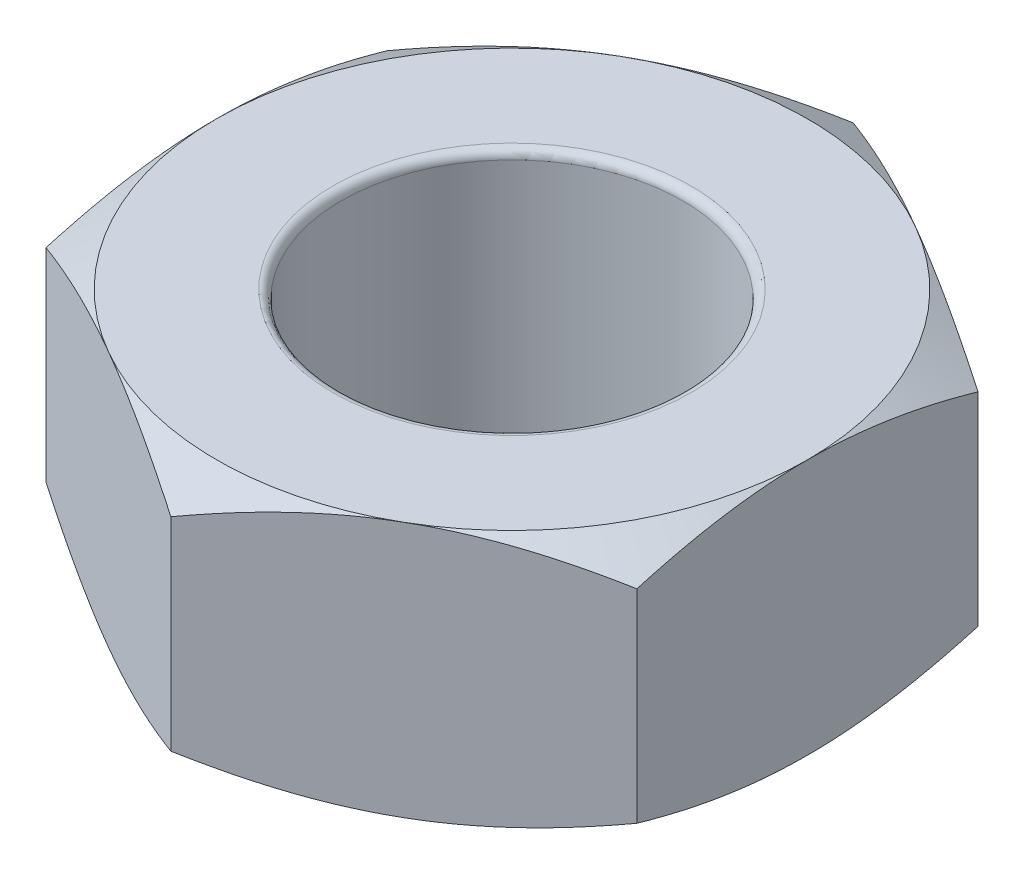
ISO-10303-21;
HEADER;
FILE_DESCRIPTION(('STEP AP214'),'2;1');
FILE_NAME('part.step','',(''),(''),'','','');
FILE_SCHEMA(('AUTOMOTIVE_DESIGN { 1 0 10303 214 1 1 1 1 }'));
ENDSEC;
DATA;
#1=APPLICATION_CONTEXT('core data for automotive mechanical design processes');
#2=APPLICATION_PROTOCOL_DEFINITION('international standard','automotive_design',2000,#1);
#3=PRODUCT_CONTEXT('',#1,'mechanical');
#4=PRODUCT('Part','Part','',(#3));
#5=PRODUCT_RELATED_PRODUCT_CATEGORY('part','',(#4));
#6=PRODUCT_DEFINITION_FORMATION('','',#4);
#7=PRODUCT_DEFINITION_CONTEXT('part definition',#1,'design');
#8=PRODUCT_DEFINITION('design','',#6,#7);
#9=PRODUCT_DEFINITION_SHAPE('','',#8);
#10=(LENGTH_UNIT() NAMED_UNIT(*) SI_UNIT(.MILLI.,.METRE.));
#11=(NAMED_UNIT(*) PLANE_ANGLE_UNIT() SI_UNIT($,.RADIAN.));
#12=(NAMED_UNIT(*) SI_UNIT($,.STERADIAN.) SOLID_ANGLE_UNIT());
#13=UNCERTAINTY_MEASURE_WITH_UNIT(LENGTH_MEASURE(1.E-05),#10,'distance_accuracy_value','');
#14=(GEOMETRIC_REPRESENTATION_CONTEXT(3) GLOBAL_UNCERTAINTY_ASSIGNED_CONTEXT((#13)) GLOBAL_UNIT_ASSIGNED_CONTEXT((#10,
#11,#12)) REPRESENTATION_CONTEXT('',''));
#15=CARTESIAN_POINT('',(0.,0.,0.));
#16=DIRECTION('',(0.,0.,1.));
#17=DIRECTION('',(1.,0.,0.));
#18=AXIS2_PLACEMENT_3D('',#15,#16,#17);
#19=CARTESIAN_POINT('',(1.73205080756888,1.5,-1.));
#20=DIRECTION('',(-0.5,0.,0.866025403784439));
#21=DIRECTION('',(0.866025403784439,0.,0.5));
#22=AXIS2_PLACEMENT_3D('',#19,#20,#21);
#23=PLANE('',#22);
#24=CARTESIAN_POINT('',(-0.000200000000000193,0.154767210819087,-2.00011547005384));
#25=CARTESIAN_POINT('',(0.0759165186948394,0.129383332818549,-1.9561695774956));
#26=CARTESIAN_POINT('',(0.152690066634804,0.106297187993155,-1.91184434892581));
#27=CARTESIAN_POINT('',(0.307566720247552,0.0659990961299756,-1.82242627127131));
#28=CARTESIAN_POINT('',(0.385672578921111,0.048801406793809,-1.77733183274084));
#29=CARTESIAN_POINT('',(0.540916268137864,0.0220293372969049,-1.68770184698156));
#30=CARTESIAN_POINT('',(0.618030205396501,0.0122767979293241,-1.64318009454701));
#31=CARTESIAN_POINT('',(0.772621133871574,0.000631938665477011,-1.55392698037765));
#32=CARTESIAN_POINT('',(0.850097562772869,-0.00127002168629369,-1.50919594329564));
#33=CARTESIAN_POINT('',(0.994880319540313,0.00267579111850239,-1.42560557970194));
#34=CARTESIAN_POINT('',(1.06220826399937,0.00755473009185104,-1.38673377284452));
#35=CARTESIAN_POINT('',(1.19642548850006,0.0230214979715317,-1.30924342214916));
#36=CARTESIAN_POINT('',(1.26331430392338,0.0336146160353385,-1.27062514655873));
#37=CARTESIAN_POINT('',(1.39780850908246,0.0600979273322419,-1.19297488100569));
#38=CARTESIAN_POINT('',(1.46539686672829,0.0761004403986394,-1.15395272452479));
#39=CARTESIAN_POINT('',(1.59956521690773,0.11242036469852,-1.07649059143196));
#40=CARTESIAN_POINT('',(1.66614692982892,0.132729235815867,-1.0380496215538));
#41=CARTESIAN_POINT('',(1.73225080756888,0.154767210819086,-0.999884529946163));
#42=B_SPLINE_CURVE_WITH_KNOTS('',3,(#24,#25,#26,#27,#28,#29,#30,#31,#32,#33,#34,#35,#36,#37,#38,
#39,#40,#41),.UNSPECIFIED.,.F.,.F.,(4,2,2,2,2,2,2,2,4),(0.,0.27455973272559,0.54977963137929,
0.818187148094556,1.08626496403989,1.31973233850631,1.55341618675482,1.79228517679321,
2.03068481371441),.UNSPECIFIED.);
#43=CARTESIAN_POINT('',(0.,0.154700538379251,-2.));
#44=VERTEX_POINT('',#43);
#45=CARTESIAN_POINT('',(0.866025403784439,0.,-1.5));
#46=VERTEX_POINT('',#45);
#47=EDGE_CURVE('E69',#44,#46,#42,.T.);
#48=ORIENTED_EDGE('',*,*,#47,.F.);
#49=DIRECTION('',(0.,-1.,0.));
#50=VECTOR('',#49,1.);
#51=CARTESIAN_POINT('',(0.,1.5,-2.));
#52=LINE('',#51,#50);
#53=CARTESIAN_POINT('',(0.,1.34529946162075,-2.));
#54=VERTEX_POINT('',#53);
#55=EDGE_CURVE('E353',#54,#44,#52,.T.);
#56=ORIENTED_EDGE('',*,*,#55,.F.);
#57=CARTESIAN_POINT('',(1.73225080756888,1.34523278918091,-0.999884529946163));
#58=CARTESIAN_POINT('',(1.65613428887404,1.37061666718145,-1.04383042250441));
#59=CARTESIAN_POINT('',(1.57936074093407,1.39370281200685,-1.08815565107419));
#60=CARTESIAN_POINT('',(1.42448408732132,1.43400090387002,-1.1775737287287));
#61=CARTESIAN_POINT('',(1.34637822864777,1.45119859320619,-1.22266816725916));
#62=CARTESIAN_POINT('',(1.19113453943101,1.4779706627031,-1.31229815301844));
#63=CARTESIAN_POINT('',(1.11402060217238,1.48772320207068,-1.35681990545299));
#64=CARTESIAN_POINT('',(0.959429673697302,1.49936806133452,-1.44607301962235));
#65=CARTESIAN_POINT('',(0.881953244796007,1.50127002168629,-1.49080405670436));
#66=CARTESIAN_POINT('',(0.737170488028564,1.4973242088815,-1.57439442029806));
#67=CARTESIAN_POINT('',(0.669842543569503,1.49244526990815,-1.61326622715548));
#68=CARTESIAN_POINT('',(0.535625319068816,1.47697850202847,-1.69075657785084));
#69=CARTESIAN_POINT('',(0.468736503645497,1.46638538396466,-1.72937485344127));
#70=CARTESIAN_POINT('',(0.334242298486415,1.43990207266776,-1.80702511899431));
#71=CARTESIAN_POINT('',(0.266653940840587,1.42389955960136,-1.84604727547521));
#72=CARTESIAN_POINT('',(0.132485590661142,1.38757963530148,-1.92350940856804));
#73=CARTESIAN_POINT('',(0.0659038777399554,1.36727076418413,-1.9619503784462));
#74=CARTESIAN_POINT('',(-0.000200000000000049,1.34523278918091,-2.00011547005384));
#75=B_SPLINE_CURVE_WITH_KNOTS('',3,(#57,#58,#59,#60,#61,#62,#63,#64,#65,#66,#67,#68,#69,#70,#71,
#72,#73,#74),.UNSPECIFIED.,.F.,.F.,(4,2,2,2,2,2,2,2,4),(0.,0.274559732725589,0.54977963137929,
0.818187148094555,1.08626496403989,1.31973233850631,1.55341618675482,1.79228517679321,
2.03068481371441),.UNSPECIFIED.);
#76=CARTESIAN_POINT('',(0.866025403784439,1.5,-1.5));
#77=VERTEX_POINT('',#76);
#78=EDGE_CURVE('E284',#77,#54,#75,.T.);
#79=ORIENTED_EDGE('',*,*,#78,.F.);
#80=CARTESIAN_POINT('',(1.73205080756888,1.34529946162075,-1.));
#81=VERTEX_POINT('',#80);
#82=EDGE_CURVE('E372',#81,#77,#75,.T.);
#83=ORIENTED_EDGE('',*,*,#82,.F.);
#84=DIRECTION('',(0.,-1.,0.));
#85=VECTOR('',#84,1.);
#86=CARTESIAN_POINT('',(1.73205080756888,1.5,-1.));
#87=LINE('',#86,#85);
#88=CARTESIAN_POINT('',(1.73205080756888,0.15470053837925,-1.));
#89=VERTEX_POINT('',#88);
#90=EDGE_CURVE('E369',#81,#89,#87,.T.);
#91=ORIENTED_EDGE('',*,*,#90,.T.);
#92=EDGE_CURVE('E157',#46,#89,#42,.T.);
#93=ORIENTED_EDGE('',*,*,#92,.F.);
#94=EDGE_LOOP('',(#48,#56,#79,#83,#91,#93));
#95=FACE_BOUND('',#94,.T.);
#96=ADVANCED_FACE('F53',(#95),#23,.F.);
#97=CARTESIAN_POINT('',(0.,1.5,-2.));
#98=DIRECTION('',(0.5,0.,0.866025403784439));
#99=DIRECTION('',(0.866025403784439,0.,-0.5));
#100=AXIS2_PLACEMENT_3D('',#97,#98,#99);
#101=PLANE('',#100);
#102=CARTESIAN_POINT('',(-1.73225080756888,0.154767210819087,-0.999884529946163));
#103=CARTESIAN_POINT('',(-1.65613428887404,0.129383332818549,-1.04383042250441));
#104=CARTESIAN_POINT('',(-1.57936074093407,0.106297187993155,-1.08815565107419));
#105=CARTESIAN_POINT('',(-1.42448408732133,0.0659990961299757,-1.1775737287287));
#106=CARTESIAN_POINT('',(-1.34637822864777,0.048801406793809,-1.22266816725916));
#107=CARTESIAN_POINT('',(-1.19113453943101,0.022029337296905,-1.31229815301844));
#108=CARTESIAN_POINT('',(-1.11402060217238,0.0122767979293242,-1.35681990545299));
#109=CARTESIAN_POINT('',(-0.959429673697303,0.000631938665477067,-1.44607301962235));
#110=CARTESIAN_POINT('',(-0.881953244796008,-0.00127002168629364,-1.49080405670436));
#111=CARTESIAN_POINT('',(-0.737170488028564,0.00267579111850253,-1.57439442029806));
#112=CARTESIAN_POINT('',(-0.669842543569503,0.00755473009185129,-1.61326622715548));
#113=CARTESIAN_POINT('',(-0.535625319068816,0.0230214979715321,-1.69075657785084));
#114=CARTESIAN_POINT('',(-0.468736503645497,0.0336146160353389,-1.72937485344127));
#115=CARTESIAN_POINT('',(-0.334242298486415,0.0600979273322423,-1.80702511899431));
#116=CARTESIAN_POINT('',(-0.266653940840587,0.0761004403986399,-1.84604727547521));
#117=CARTESIAN_POINT('',(-0.132485590661142,0.112420364698521,-1.92350940856804));
#118=CARTESIAN_POINT('',(-0.0659038777399555,0.132729235815868,-1.9619503784462));
#119=CARTESIAN_POINT('',(0.000200000000000089,0.154767210819087,-2.00011547005384));
#120=B_SPLINE_CURVE_WITH_KNOTS('',3,(#102,#103,#104,#105,#106,#107,#108,#109,#110,#111,#112,
#113,#114,#115,#116,#117,#118,#119),.UNSPECIFIED.,.F.,.F.,(4,2,2,2,2,2,2,2,4),(0.,
0.274559732725589,0.54977963137929,0.818187148094556,1.08626496403989,1.31973233850631,
1.55341618675482,1.79228517679322,2.03068481371441),.UNSPECIFIED.);
#121=CARTESIAN_POINT('',(-1.73205080756888,0.154700538379251,-1.));
#122=VERTEX_POINT('',#121);
#123=CARTESIAN_POINT('',(-0.866025403784439,0.,-1.5));
#124=VERTEX_POINT('',#123);
#125=EDGE_CURVE('E77',#122,#124,#120,.T.);
#126=ORIENTED_EDGE('',*,*,#125,.F.);
#127=DIRECTION('',(0.,-1.,0.));
#128=VECTOR('',#127,1.);
#129=CARTESIAN_POINT('',(-1.73205080756888,1.5,-1.));
#130=LINE('',#129,#128);
#131=CARTESIAN_POINT('',(-1.73205080756888,1.34529946162075,-1.));
#132=VERTEX_POINT('',#131);
#133=EDGE_CURVE('E357',#132,#122,#130,.T.);
#134=ORIENTED_EDGE('',*,*,#133,.F.);
#135=CARTESIAN_POINT('',(0.000199999999999846,1.34523278918091,-2.00011547005384));
#136=CARTESIAN_POINT('',(-0.0759165186948396,1.37061666718145,-1.9561695774956));
#137=CARTESIAN_POINT('',(-0.152690066634804,1.39370281200684,-1.91184434892581));
#138=CARTESIAN_POINT('',(-0.307566720247552,1.43400090387002,-1.82242627127131));
#139=CARTESIAN_POINT('',(-0.385672578921111,1.45119859320619,-1.77733183274084));
#140=CARTESIAN_POINT('',(-0.540916268137865,1.4779706627031,-1.68770184698156));
#141=CARTESIAN_POINT('',(-0.618030205396501,1.48772320207068,-1.64318009454701));
#142=CARTESIAN_POINT('',(-0.772621133871575,1.49936806133452,-1.55392698037765));
#143=CARTESIAN_POINT('',(-0.85009756277287,1.50127002168629,-1.50919594329564));
#144=CARTESIAN_POINT('',(-0.994880319540313,1.4973242088815,-1.42560557970194));
#145=CARTESIAN_POINT('',(-1.06220826399937,1.49244526990815,-1.38673377284452));
#146=CARTESIAN_POINT('',(-1.19642548850006,1.47697850202847,-1.30924342214916));
#147=CARTESIAN_POINT('',(-1.26331430392338,1.46638538396466,-1.27062514655873));
#148=CARTESIAN_POINT('',(-1.39780850908246,1.43990207266776,-1.19297488100569));
#149=CARTESIAN_POINT('',(-1.46539686672829,1.42389955960136,-1.15395272452479));
#150=CARTESIAN_POINT('',(-1.59956521690774,1.38757963530148,-1.07649059143196));
#151=CARTESIAN_POINT('',(-1.66614692982892,1.36727076418413,-1.0380496215538));
#152=CARTESIAN_POINT('',(-1.73225080756888,1.34523278918091,-0.999884529946163));
#153=B_SPLINE_CURVE_WITH_KNOTS('',3,(#135,#136,#137,#138,#139,#140,#141,#142,#143,#144,#145,
#146,#147,#148,#149,#150,#151,#152),.UNSPECIFIED.,.F.,.F.,(4,2,2,2,2,2,2,2,4),(0.,
0.274559732725589,0.54977963137929,0.818187148094556,1.08626496403989,1.31973233850631,
1.55341618675482,1.79228517679322,2.03068481371441),.UNSPECIFIED.);
#154=CARTESIAN_POINT('',(-0.866025403784439,1.5,-1.5));
#155=VERTEX_POINT('',#154);
#156=EDGE_CURVE('E276',#155,#132,#153,.T.);
#157=ORIENTED_EDGE('',*,*,#156,.F.);
#158=EDGE_CURVE('E283',#54,#155,#153,.T.);
#159=ORIENTED_EDGE('',*,*,#158,.F.);
#160=ORIENTED_EDGE('',*,*,#55,.T.);
#161=EDGE_CURVE('E189',#124,#44,#120,.T.);
#162=ORIENTED_EDGE('',*,*,#161,.F.);
#163=EDGE_LOOP('',(#126,#134,#157,#159,#160,#162));
#164=FACE_BOUND('',#163,.T.);
#165=ADVANCED_FACE('F290',(#164),#101,.F.);
#166=CARTESIAN_POINT('',(-1.73205080756888,1.5,-1.));
#167=DIRECTION('',(1.,0.,0.));
#168=DIRECTION('',(0.,0.,-1.));
#169=AXIS2_PLACEMENT_3D('',#166,#167,#168);
#170=PLANE('',#169);
#171=CARTESIAN_POINT('',(-1.73205080756888,1.25472836797103,3.5002));
#172=CARTESIAN_POINT('',(-1.73205080756888,1.21270316876776,3.41898141413741));
#173=CARTESIAN_POINT('',(-1.73205080756888,1.17090076865851,3.33764821075224));
#174=CARTESIAN_POINT('',(-1.73205080756888,1.08784306120711,3.17470136721006));
#175=CARTESIAN_POINT('',(-1.73205080756888,1.04658776301326,3.09308772239235));
#176=CARTESIAN_POINT('',(-1.73205080756888,0.923669288820031,2.8474984986909));
#177=CARTESIAN_POINT('',(-1.73205080756888,0.84298516472278,2.68302747411278));
#178=CARTESIAN_POINT('',(-1.73205080756888,0.722843384153396,2.43042768656936));
#179=CARTESIAN_POINT('',(-1.73205080756888,0.681937922239003,2.34298808344512));
#180=CARTESIAN_POINT('',(-1.73205080756888,0.601560507874701,2.16745378194778));
#181=CARTESIAN_POINT('',(-1.73205080756888,0.562088504642535,2.07935910691499));
#182=CARTESIAN_POINT('',(-1.73205080756888,0.48501098088733,1.90240505280635));
#183=CARTESIAN_POINT('',(-1.73205080756888,0.447404540220218,1.81354607659919));
#184=CARTESIAN_POINT('',(-1.73205080756888,0.374616129551163,1.63484513992671));
#185=CARTESIAN_POINT('',(-1.73205080756888,0.339433928504776,1.54500327408496));
#186=CARTESIAN_POINT('',(-1.73205080756888,0.267342314487574,1.35084784362632));
#187=CARTESIAN_POINT('',(-1.73205080756888,0.230936594204428,1.24634465038537));
#188=CARTESIAN_POINT('',(-1.73205080756888,0.163975832260871,1.03550034878867));
#189=CARTESIAN_POINT('',(-1.73205080756888,0.133417935655831,0.929160165052525));
#190=CARTESIAN_POINT('',(-1.73205080756888,0.0808059211059744,0.71655133275406));
#191=CARTESIAN_POINT('',(-1.73205080756888,0.0585969520152135,0.610322086773511));
#192=CARTESIAN_POINT('',(-1.73205080756888,0.0241269035945811,0.396264237475995));
#193=CARTESIAN_POINT('',(-1.73205080756888,0.0118598825395636,0.288436628706989));
#194=CARTESIAN_POINT('',(-1.73205080756888,-0.00115685488455073,0.0704248932692721));
#195=CARTESIAN_POINT('',(-1.73205080756888,-0.0017306186725579,-0.0397702878210252));
#196=CARTESIAN_POINT('',(-1.73205080756888,0.00918341161357058,-0.259562580407462));
#197=CARTESIAN_POINT('',(-1.73205080756888,0.0206746669828802,-0.369159511203943));
#198=CARTESIAN_POINT('',(-1.73205080756888,0.0544132919530276,-0.588951518486415));
#199=CARTESIAN_POINT('',(-1.73205080756888,0.0768793317815982,-0.699111653280236));
#200=CARTESIAN_POINT('',(-1.73205080756888,0.130156974687668,-0.917374597457742));
#201=CARTESIAN_POINT('',(-1.73205080756888,0.160971774943208,-1.02547660166626));
#202=CARTESIAN_POINT('',(-1.73205080756888,0.228415317711028,-1.23892452125311));
#203=CARTESIAN_POINT('',(-1.73205080756888,0.264998923406584,-1.34428499009296));
#204=CARTESIAN_POINT('',(-1.73205080756888,0.342472165522482,-1.55342383574145));
#205=CARTESIAN_POINT('',(-1.73205080756888,0.383363024008193,-1.65720175393206));
#206=CARTESIAN_POINT('',(-1.73205080756888,0.468300391429515,-1.86358689323178));
#207=CARTESIAN_POINT('',(-1.73205080756888,0.512350486049606,-1.966192625836));
#208=CARTESIAN_POINT('',(-1.73205080756888,0.602738559610233,-2.17039283651753));
#209=CARTESIAN_POINT('',(-1.73205080756888,0.649076675082705,-2.27198725381139));
#210=CARTESIAN_POINT('',(-1.73205080756888,0.740654325439852,-2.46835472186679));
#211=CARTESIAN_POINT('',(-1.73205080756888,0.785795185673095,-2.563173984224));
#212=CARTESIAN_POINT('',(-1.73205080756888,0.877250450892286,-2.7522479187581));
#213=CARTESIAN_POINT('',(-1.73205080756888,0.923564899248911,-2.84650256990983));
#214=CARTESIAN_POINT('',(-1.73205080756888,1.01694315968054,-3.03421263080168));
#215=CARTESIAN_POINT('',(-1.73205080756888,1.06400364491327,-3.12766969941864));
#216=CARTESIAN_POINT('',(-1.73205080756888,1.15885831902139,-3.3142003324061));
#217=CARTESIAN_POINT('',(-1.73205080756888,1.20665244072873,-3.40727393090713));
#218=CARTESIAN_POINT('',(-1.73205080756888,1.25472836797103,-3.5002));
#219=B_SPLINE_CURVE_WITH_KNOTS('',3,(#171,#172,#173,#174,#175,#176,#177,#178,#179,#180,#181,
#182,#183,#184,#185,#186,#187,#188,#189,#190,#191,#192,#193,#194,#195,#196,#197,#198,#199,#200,
#201,#202,#203,#204,#205,#206,#207,#208,#209,#210,#211,#212,#213,#214,#215,#216,#217,#218),
.UNSPECIFIED.,.F.,.F.,(4,2,2,2,2,2,2,2,2,2,2,2,2,2,2,2,2,2,2,2,2,2,2,4),(0.,0.274339433850929,
0.548683449265063,1.09822658782748,1.38782117882733,1.67740550051019,1.96684554185917,
2.25625795958764,2.58812456595652,2.91982873728265,3.24503531110895,3.57004738422789,
3.89994647679448,4.2299402389355,4.56679513036709,4.90377920397771,5.23824669540495,
5.57280933976728,5.90775790755156,6.24272648676792,6.55776506644743,6.87281530560184,
7.186722965665,7.50060205535077),.UNSPECIFIED.);
#220=CARTESIAN_POINT('',(-1.73205080756888,0.15470053837925,1.));
#221=VERTEX_POINT('',#220);
#222=CARTESIAN_POINT('',(-1.73205080756888,0.,0.));
#223=VERTEX_POINT('',#222);
#224=EDGE_CURVE('E411',#221,#223,#219,.T.);
#225=ORIENTED_EDGE('',*,*,#224,.F.);
#226=DIRECTION('',(0.,-1.,0.));
#227=VECTOR('',#226,1.);
#228=CARTESIAN_POINT('',(-1.73205080756888,1.5,1.));
#229=LINE('',#228,#227);
#230=CARTESIAN_POINT('',(-1.73205080756888,1.34529946162075,1.));
#231=VERTEX_POINT('',#230);
#232=EDGE_CURVE('E361',#231,#221,#229,.T.);
#233=ORIENTED_EDGE('',*,*,#232,.F.);
#234=CARTESIAN_POINT('',(-1.73205080756888,0.24527163202897,-3.5002));
#235=CARTESIAN_POINT('',(-1.73205080756888,0.287296831232237,-3.41898141413741));
#236=CARTESIAN_POINT('',(-1.73205080756888,0.329099231341488,-3.33764821075224));
#237=CARTESIAN_POINT('',(-1.73205080756888,0.412156938792886,-3.17470136721006));
#238=CARTESIAN_POINT('',(-1.73205080756888,0.453412236986736,-3.09308772239235));
#239=CARTESIAN_POINT('',(-1.73205080756888,0.576330711179969,-2.8474984986909));
#240=CARTESIAN_POINT('',(-1.73205080756888,0.65701483527722,-2.68302747411278));
#241=CARTESIAN_POINT('',(-1.73205080756888,0.777156615846604,-2.43042768656936));
#242=CARTESIAN_POINT('',(-1.73205080756888,0.818062077760997,-2.34298808344511));
#243=CARTESIAN_POINT('',(-1.73205080756888,0.898439492125299,-2.16745378194778));
#244=CARTESIAN_POINT('',(-1.73205080756888,0.937911495357465,-2.07935910691499));
#245=CARTESIAN_POINT('',(-1.73205080756888,1.01498901911267,-1.90240505280635));
#246=CARTESIAN_POINT('',(-1.73205080756888,1.05259545977978,-1.81354607659919));
#247=CARTESIAN_POINT('',(-1.73205080756888,1.12538387044884,-1.63484513992671));
#248=CARTESIAN_POINT('',(-1.73205080756888,1.16056607149522,-1.54500327408496));
#249=CARTESIAN_POINT('',(-1.73205080756888,1.23265768551243,-1.35084784362632));
#250=CARTESIAN_POINT('',(-1.73205080756888,1.26906340579557,-1.24634465038537));
#251=CARTESIAN_POINT('',(-1.73205080756888,1.33602416773913,-1.03550034878867));
#252=CARTESIAN_POINT('',(-1.73205080756888,1.36658206434417,-0.929160165052525));
#253=CARTESIAN_POINT('',(-1.73205080756888,1.41919407889403,-0.716551332754059));
#254=CARTESIAN_POINT('',(-1.73205080756888,1.44140304798479,-0.61032208677351));
#255=CARTESIAN_POINT('',(-1.73205080756888,1.47587309640542,-0.396264237475994));
#256=CARTESIAN_POINT('',(-1.73205080756888,1.48814011746044,-0.288436628706988));
#257=CARTESIAN_POINT('',(-1.73205080756888,1.50115685488455,-0.0704248932692712));
#258=CARTESIAN_POINT('',(-1.73205080756888,1.50173061867256,0.0397702878210261));
#259=CARTESIAN_POINT('',(-1.73205080756888,1.49081658838643,0.259562580407462));
#260=CARTESIAN_POINT('',(-1.73205080756888,1.47932533301712,0.369159511203944));
#261=CARTESIAN_POINT('',(-1.73205080756888,1.44558670804697,0.588951518486416));
#262=CARTESIAN_POINT('',(-1.73205080756888,1.4231206682184,0.699111653280237));
#263=CARTESIAN_POINT('',(-1.73205080756888,1.36984302531233,0.917374597457744));
#264=CARTESIAN_POINT('',(-1.73205080756888,1.33902822505679,1.02547660166627));
#265=CARTESIAN_POINT('',(-1.73205080756888,1.27158468228897,1.23892452125312));
#266=CARTESIAN_POINT('',(-1.73205080756888,1.23500107659342,1.34428499009296));
#267=CARTESIAN_POINT('',(-1.73205080756888,1.15752783447752,1.55342383574145));
#268=CARTESIAN_POINT('',(-1.73205080756888,1.11663697599181,1.65720175393206));
#269=CARTESIAN_POINT('',(-1.73205080756888,1.03169960857048,1.86358689323178));
#270=CARTESIAN_POINT('',(-1.73205080756888,0.987649513950394,1.966192625836));
#271=CARTESIAN_POINT('',(-1.73205080756888,0.897261440389768,2.17039283651753));
#272=CARTESIAN_POINT('',(-1.73205080756888,0.850923324917295,2.27198725381139));
#273=CARTESIAN_POINT('',(-1.73205080756888,0.759345674560149,2.46835472186679));
#274=CARTESIAN_POINT('',(-1.73205080756888,0.714204814326906,2.563173984224));
#275=CARTESIAN_POINT('',(-1.73205080756888,0.622749549107715,2.7522479187581));
#276=CARTESIAN_POINT('',(-1.73205080756888,0.576435100751089,2.84650256990983));
#277=CARTESIAN_POINT('',(-1.73205080756888,0.483056840319463,3.03421263080167));
#278=CARTESIAN_POINT('',(-1.73205080756888,0.435996355086728,3.12766969941864));
#279=CARTESIAN_POINT('',(-1.73205080756888,0.341141680978613,3.3142003324061));
#280=CARTESIAN_POINT('',(-1.73205080756888,0.293347559271275,3.40727393090713));
#281=CARTESIAN_POINT('',(-1.73205080756888,0.245271632028971,3.5002));
#282=B_SPLINE_CURVE_WITH_KNOTS('',3,(#234,#235,#236,#237,#238,#239,#240,#241,#242,#243,#244,
#245,#246,#247,#248,#249,#250,#251,#252,#253,#254,#255,#256,#257,#258,#259,#260,#261,#262,#263,
#264,#265,#266,#267,#268,#269,#270,#271,#272,#273,#274,#275,#276,#277,#278,#279,#280,#281),
.UNSPECIFIED.,.F.,.F.,(4,2,2,2,2,2,2,2,2,2,2,2,2,2,2,2,2,2,2,2,2,2,2,4),(0.,0.274339433850929,
0.548683449265063,1.09822658782749,1.38782117882733,1.67740550051019,1.96684554185917,
2.25625795958764,2.58812456595652,2.91982873728265,3.24503531110895,3.57004738422789,
3.89994647679449,4.2299402389355,4.5667951303671,4.90377920397771,5.23824669540495,
5.57280933976728,5.90775790755156,6.24272648676792,6.55776506644743,6.87281530560184,
7.18672296566501,7.50060205535077),.UNSPECIFIED.);
#283=CARTESIAN_POINT('',(-1.73205080756888,1.5,0.));
#284=VERTEX_POINT('',#283);
#285=EDGE_CURVE('E268',#284,#231,#282,.T.);
#286=ORIENTED_EDGE('',*,*,#285,.F.);
#287=EDGE_CURVE('E275',#132,#284,#282,.T.);
#288=ORIENTED_EDGE('',*,*,#287,.F.);
#289=ORIENTED_EDGE('',*,*,#133,.T.);
#290=EDGE_CURVE('E225',#223,#122,#219,.T.);
#291=ORIENTED_EDGE('',*,*,#290,.F.);
#292=EDGE_LOOP('',(#225,#233,#286,#288,#289,#291));
#293=FACE_BOUND('',#292,.T.);
#294=ADVANCED_FACE('F248',(#293),#170,.F.);
#295=CARTESIAN_POINT('',(-1.73205080756888,1.5,1.));
#296=DIRECTION('',(0.5,0.,-0.866025403784439));
#297=DIRECTION('',(-0.866025403784439,0.,-0.5));
#298=AXIS2_PLACEMENT_3D('',#295,#296,#297);
#299=PLANE('',#298);
#300=CARTESIAN_POINT('',(0.000199999999999623,0.154767210819086,2.00011547005384));
#301=CARTESIAN_POINT('',(-0.0759165186948399,0.129383332818549,1.95616957749559));
#302=CARTESIAN_POINT('',(-0.152690066634804,0.106297187993155,1.91184434892581));
#303=CARTESIAN_POINT('',(-0.307566720247553,0.0659990961299753,1.8224262712713));
#304=CARTESIAN_POINT('',(-0.385672578921111,0.0488014067938086,1.77733183274084));
#305=CARTESIAN_POINT('',(-0.540916268137865,0.0220293372969047,1.68770184698156));
#306=CARTESIAN_POINT('',(-0.618030205396501,0.0122767979293239,1.64318009454701));
#307=CARTESIAN_POINT('',(-0.772621133871575,0.000631938665476742,1.55392698037765));
#308=CARTESIAN_POINT('',(-0.850097562772869,-0.00127002168629401,1.50919594329564));
#309=CARTESIAN_POINT('',(-0.994880319540313,0.00267579111850214,1.42560557970194));
#310=CARTESIAN_POINT('',(-1.06220826399937,0.00755473009185091,1.38673377284452));
#311=CARTESIAN_POINT('',(-1.19642548850006,0.0230214979715317,1.30924342214916));
#312=CARTESIAN_POINT('',(-1.26331430392338,0.0336146160353384,1.27062514655873));
#313=CARTESIAN_POINT('',(-1.39780850908246,0.0600979273322418,1.19297488100569));
#314=CARTESIAN_POINT('',(-1.46539686672829,0.0761004403986394,1.15395272452479));
#315=CARTESIAN_POINT('',(-1.59956521690774,0.11242036469852,1.07649059143196));
#316=CARTESIAN_POINT('',(-1.66614692982892,0.132729235815868,1.0380496215538));
#317=CARTESIAN_POINT('',(-1.73225080756888,0.154767210819086,0.999884529946162));
#318=B_SPLINE_CURVE_WITH_KNOTS('',3,(#300,#301,#302,#303,#304,#305,#306,#307,#308,#309,#310,
#311,#312,#313,#314,#315,#316,#317),.UNSPECIFIED.,.F.,.F.,(4,2,2,2,2,2,2,2,4),(0.,
0.274559732725589,0.54977963137929,0.818187148094555,1.08626496403989,1.31973233850631,
1.55341618675482,1.79228517679322,2.03068481371441),.UNSPECIFIED.);
#319=CARTESIAN_POINT('',(0.,0.15470053837925,2.));
#320=VERTEX_POINT('',#319);
#321=CARTESIAN_POINT('',(-0.866025403784439,0.,1.5));
#322=VERTEX_POINT('',#321);
#323=EDGE_CURVE('E167',#320,#322,#318,.T.);
#324=ORIENTED_EDGE('',*,*,#323,.F.);
#325=DIRECTION('',(0.,-1.,0.));
#326=VECTOR('',#325,1.);
#327=CARTESIAN_POINT('',(0.,1.5,2.));
#328=LINE('',#327,#326);
#329=CARTESIAN_POINT('',(0.,1.34529946162075,2.));
#330=VERTEX_POINT('',#329);
#331=EDGE_CURVE('E185',#330,#320,#328,.T.);
#332=ORIENTED_EDGE('',*,*,#331,.F.);
#333=CARTESIAN_POINT('',(-1.73225080756888,1.34523278918091,0.999884529946162));
#334=CARTESIAN_POINT('',(-1.65613428887404,1.37061666718145,1.0438304225044));
#335=CARTESIAN_POINT('',(-1.57936074093407,1.39370281200685,1.08815565107419));
#336=CARTESIAN_POINT('',(-1.42448408732132,1.43400090387002,1.17757372872869));
#337=CARTESIAN_POINT('',(-1.34637822864777,1.45119859320619,1.22266816725916));
#338=CARTESIAN_POINT('',(-1.19113453943101,1.4779706627031,1.31229815301844));
#339=CARTESIAN_POINT('',(-1.11402060217238,1.48772320207068,1.35681990545299));
#340=CARTESIAN_POINT('',(-0.959429673697303,1.49936806133452,1.44607301962235));
#341=CARTESIAN_POINT('',(-0.881953244796008,1.50127002168629,1.49080405670436));
#342=CARTESIAN_POINT('',(-0.737170488028564,1.4973242088815,1.57439442029806));
#343=CARTESIAN_POINT('',(-0.669842543569503,1.49244526990815,1.61326622715548));
#344=CARTESIAN_POINT('',(-0.535625319068816,1.47697850202847,1.69075657785084));
#345=CARTESIAN_POINT('',(-0.468736503645497,1.46638538396466,1.72937485344127));
#346=CARTESIAN_POINT('',(-0.334242298486415,1.43990207266776,1.80702511899431));
#347=CARTESIAN_POINT('',(-0.266653940840587,1.42389955960136,1.84604727547521));
#348=CARTESIAN_POINT('',(-0.132485590661142,1.38757963530148,1.92350940856804));
#349=CARTESIAN_POINT('',(-0.0659038777399559,1.36727076418413,1.9619503784462));
#350=CARTESIAN_POINT('',(0.000199999999999752,1.34523278918091,2.00011547005384));
#351=B_SPLINE_CURVE_WITH_KNOTS('',3,(#333,#334,#335,#336,#337,#338,#339,#340,#341,#342,#343,
#344,#345,#346,#347,#348,#349,#350),.UNSPECIFIED.,.F.,.F.,(4,2,2,2,2,2,2,2,4),(0.,
0.274559732725589,0.54977963137929,0.818187148094555,1.08626496403989,1.31973233850631,
1.55341618675482,1.79228517679322,2.03068481371441),.UNSPECIFIED.);
#352=CARTESIAN_POINT('',(-0.866025403784439,1.5,1.5));
#353=VERTEX_POINT('',#352);
#354=EDGE_CURVE('E253',#353,#330,#351,.T.);
#355=ORIENTED_EDGE('',*,*,#354,.F.);
#356=EDGE_CURVE('E261',#231,#353,#351,.T.);
#357=ORIENTED_EDGE('',*,*,#356,.F.);
#358=ORIENTED_EDGE('',*,*,#232,.T.);
#359=EDGE_CURVE('E191',#322,#221,#318,.T.);
#360=ORIENTED_EDGE('',*,*,#359,.F.);
#361=EDGE_LOOP('',(#324,#332,#355,#357,#358,#360));
#362=FACE_BOUND('',#361,.T.);
#363=ADVANCED_FACE('F245',(#362),#299,.F.);
#364=CARTESIAN_POINT('',(0.,1.5,2.));
#365=DIRECTION('',(-0.5,0.,-0.866025403784439));
#366=DIRECTION('',(-0.866025403784439,0.,0.5));
#367=AXIS2_PLACEMENT_3D('',#364,#365,#366);
#368=PLANE('',#367);
#369=CARTESIAN_POINT('',(1.73225080756888,0.154767210819086,0.999884529946162));
#370=CARTESIAN_POINT('',(1.65613428887404,0.129383332818549,1.04383042250441));
#371=CARTESIAN_POINT('',(1.57936074093407,0.106297187993155,1.08815565107419));
#372=CARTESIAN_POINT('',(1.42448408732132,0.0659990961299754,1.17757372872869));
#373=CARTESIAN_POINT('',(1.34637822864777,0.0488014067938088,1.22266816725916));
#374=CARTESIAN_POINT('',(1.19113453943101,0.0220293372969047,1.31229815301844));
#375=CARTESIAN_POINT('',(1.11402060217238,0.0122767979293238,1.35681990545299));
#376=CARTESIAN_POINT('',(0.959429673697303,0.000631938665476575,1.44607301962235));
#377=CARTESIAN_POINT('',(0.881953244796008,-0.00127002168629415,1.49080405670436));
#378=CARTESIAN_POINT('',(0.737170488028564,0.00267579111850203,1.57439442029806));
#379=CARTESIAN_POINT('',(0.669842543569503,0.00755473009185082,1.61326622715548));
#380=CARTESIAN_POINT('',(0.535625319068816,0.0230214979715316,1.69075657785084));
#381=CARTESIAN_POINT('',(0.468736503645496,0.0336146160353383,1.72937485344127));
#382=CARTESIAN_POINT('',(0.334242298486415,0.0600979273322417,1.80702511899431));
#383=CARTESIAN_POINT('',(0.266653940840587,0.0761004403986393,1.84604727547521));
#384=CARTESIAN_POINT('',(0.132485590661141,0.11242036469852,1.92350940856804));
#385=CARTESIAN_POINT('',(0.065903877739955,0.132729235815867,1.9619503784462));
#386=CARTESIAN_POINT('',(-0.000200000000000602,0.154767210819086,2.00011547005384));
#387=B_SPLINE_CURVE_WITH_KNOTS('',3,(#369,#370,#371,#372,#373,#374,#375,#376,#377,#378,#379,
#380,#381,#382,#383,#384,#385,#386),.UNSPECIFIED.,.F.,.F.,(4,2,2,2,2,2,2,2,4),(0.,
0.274559732725589,0.54977963137929,0.818187148094555,1.08626496403989,1.31973233850631,
1.55341618675482,1.79228517679322,2.03068481371441),.UNSPECIFIED.);
#388=CARTESIAN_POINT('',(1.73205080756888,0.154700538379248,1.));
#389=VERTEX_POINT('',#388);
#390=CARTESIAN_POINT('',(0.866025403784438,0.,1.5));
#391=VERTEX_POINT('',#390);
#392=EDGE_CURVE('E144',#389,#391,#387,.T.);
#393=ORIENTED_EDGE('',*,*,#392,.F.);
#394=DIRECTION('',(0.,-1.,0.));
#395=VECTOR('',#394,1.);
#396=CARTESIAN_POINT('',(1.73205080756888,1.5,1.));
#397=LINE('',#396,#395);
#398=CARTESIAN_POINT('',(1.73205080756888,1.34529946162075,1.));
#399=VERTEX_POINT('',#398);
#400=EDGE_CURVE('E367',#399,#389,#397,.T.);
#401=ORIENTED_EDGE('',*,*,#400,.F.);
#402=CARTESIAN_POINT('',(-0.00020000000000043,1.34523278918091,2.00011547005384));
#403=CARTESIAN_POINT('',(0.075916518694839,1.37061666718145,1.95616957749559));
#404=CARTESIAN_POINT('',(0.152690066634804,1.39370281200685,1.91184434892581));
#405=CARTESIAN_POINT('',(0.307566720247552,1.43400090387002,1.82242627127131));
#406=CARTESIAN_POINT('',(0.385672578921111,1.45119859320619,1.77733183274084));
#407=CARTESIAN_POINT('',(0.540916268137864,1.4779706627031,1.68770184698156));
#408=CARTESIAN_POINT('',(0.6180302053965,1.48772320207068,1.64318009454701));
#409=CARTESIAN_POINT('',(0.772621133871574,1.49936806133452,1.55392698037765));
#410=CARTESIAN_POINT('',(0.850097562772869,1.50127002168629,1.50919594329564));
#411=CARTESIAN_POINT('',(0.994880319540312,1.4973242088815,1.42560557970194));
#412=CARTESIAN_POINT('',(1.06220826399937,1.49244526990815,1.38673377284452));
#413=CARTESIAN_POINT('',(1.19642548850006,1.47697850202847,1.30924342214916));
#414=CARTESIAN_POINT('',(1.26331430392338,1.46638538396466,1.27062514655873));
#415=CARTESIAN_POINT('',(1.39780850908246,1.43990207266776,1.19297488100569));
#416=CARTESIAN_POINT('',(1.46539686672829,1.42389955960136,1.15395272452479));
#417=CARTESIAN_POINT('',(1.59956521690773,1.38757963530148,1.07649059143196));
#418=CARTESIAN_POINT('',(1.66614692982892,1.36727076418413,1.0380496215538));
#419=CARTESIAN_POINT('',(1.73225080756888,1.34523278918091,0.999884529946162));
#420=B_SPLINE_CURVE_WITH_KNOTS('',3,(#402,#403,#404,#405,#406,#407,#408,#409,#410,#411,#412,
#413,#414,#415,#416,#417,#418,#419),.UNSPECIFIED.,.F.,.F.,(4,2,2,2,2,2,2,2,4),(0.,
0.274559732725589,0.54977963137929,0.818187148094555,1.08626496403989,1.31973233850631,
1.55341618675482,1.79228517679322,2.03068481371441),.UNSPECIFIED.);
#421=CARTESIAN_POINT('',(0.866025403784438,1.5,1.5));
#422=VERTEX_POINT('',#421);
#423=EDGE_CURVE('E263',#422,#399,#420,.T.);
#424=ORIENTED_EDGE('',*,*,#423,.F.);
#425=EDGE_CURVE('E262',#330,#422,#420,.T.);
#426=ORIENTED_EDGE('',*,*,#425,.F.);
#427=ORIENTED_EDGE('',*,*,#331,.T.);
#428=EDGE_CURVE('E160',#391,#320,#387,.T.);
#429=ORIENTED_EDGE('',*,*,#428,.F.);
#430=EDGE_LOOP('',(#393,#401,#424,#426,#427,#429));
#431=FACE_BOUND('',#430,.T.);
#432=ADVANCED_FACE('F182',(#431),#368,.F.);
#433=CARTESIAN_POINT('',(1.73205080756888,1.5,1.));
#434=DIRECTION('',(-1.,0.,0.));
#435=DIRECTION('',(0.,0.,1.));
#436=AXIS2_PLACEMENT_3D('',#433,#434,#435);
#437=PLANE('',#436);
#438=CARTESIAN_POINT('',(1.73205080756888,1.25472836797103,-3.5002));
#439=CARTESIAN_POINT('',(1.73205080756888,1.21270316876776,-3.41898141413742));
#440=CARTESIAN_POINT('',(1.73205080756888,1.17090076865851,-3.33764821075224));
#441=CARTESIAN_POINT('',(1.73205080756888,1.08784306120711,-3.17470136721006));
#442=CARTESIAN_POINT('',(1.73205080756888,1.04658776301326,-3.09308772239235));
#443=CARTESIAN_POINT('',(1.73205080756888,0.923669288820031,-2.8474984986909));
#444=CARTESIAN_POINT('',(1.73205080756888,0.84298516472278,-2.68302747411279));
#445=CARTESIAN_POINT('',(1.73205080756888,0.722843384153396,-2.43042768656936));
#446=CARTESIAN_POINT('',(1.73205080756888,0.681937922239003,-2.34298808344512));
#447=CARTESIAN_POINT('',(1.73205080756888,0.601560507874701,-2.16745378194778));
#448=CARTESIAN_POINT('',(1.73205080756888,0.562088504642535,-2.07935910691499));
#449=CARTESIAN_POINT('',(1.73205080756888,0.48501098088733,-1.90240505280635));
#450=CARTESIAN_POINT('',(1.73205080756888,0.447404540220218,-1.81354607659919));
#451=CARTESIAN_POINT('',(1.73205080756888,0.374616129551163,-1.63484513992671));
#452=CARTESIAN_POINT('',(1.73205080756888,0.339433928504776,-1.54500327408496));
#453=CARTESIAN_POINT('',(1.73205080756888,0.267342314487574,-1.35084784362632));
#454=CARTESIAN_POINT('',(1.73205080756888,0.230936594204428,-1.24634465038537));
#455=CARTESIAN_POINT('',(1.73205080756888,0.163975832260871,-1.03550034878867));
#456=CARTESIAN_POINT('',(1.73205080756888,0.133417935655831,-0.929160165052527));
#457=CARTESIAN_POINT('',(1.73205080756888,0.0808059211059741,-0.716551332754061));
#458=CARTESIAN_POINT('',(1.73205080756888,0.058596952015213,-0.610322086773512));
#459=CARTESIAN_POINT('',(1.73205080756888,0.0241269035945806,-0.396264237475996));
#460=CARTESIAN_POINT('',(1.73205080756888,0.0118598825395632,-0.28843662870699));
#461=CARTESIAN_POINT('',(1.73205080756888,-0.00115685488455116,-0.0704248932692729));
#462=CARTESIAN_POINT('',(1.73205080756888,-0.00173061867255846,0.0397702878210245));
#463=CARTESIAN_POINT('',(1.73205080756888,0.00918341161356993,0.259562580407461));
#464=CARTESIAN_POINT('',(1.73205080756888,0.0206746669828796,0.369159511203943));
#465=CARTESIAN_POINT('',(1.73205080756888,0.0544132919530273,0.588951518486415));
#466=CARTESIAN_POINT('',(1.73205080756888,0.0768793317815979,0.699111653280236));
#467=CARTESIAN_POINT('',(1.73205080756888,0.130156974687668,0.917374597457742));
#468=CARTESIAN_POINT('',(1.73205080756888,0.160971774943208,1.02547660166626));
#469=CARTESIAN_POINT('',(1.73205080756888,0.228415317711027,1.23892452125311));
#470=CARTESIAN_POINT('',(1.73205080756888,0.264998923406584,1.34428499009296));
#471=CARTESIAN_POINT('',(1.73205080756888,0.342472165522481,1.55342383574145));
#472=CARTESIAN_POINT('',(1.73205080756888,0.383363024008193,1.65720175393206));
#473=CARTESIAN_POINT('',(1.73205080756888,0.468300391429515,1.86358689323178));
#474=CARTESIAN_POINT('',(1.73205080756888,0.512350486049605,1.966192625836));
#475=CARTESIAN_POINT('',(1.73205080756888,0.602738559610232,2.17039283651753));
#476=CARTESIAN_POINT('',(1.73205080756888,0.649076675082704,2.27198725381139));
#477=CARTESIAN_POINT('',(1.73205080756888,0.740654325439851,2.46835472186679));
#478=CARTESIAN_POINT('',(1.73205080756888,0.785795185673094,2.563173984224));
#479=CARTESIAN_POINT('',(1.73205080756888,0.877250450892285,2.7522479187581));
#480=CARTESIAN_POINT('',(1.73205080756888,0.923564899248911,2.84650256990983));
#481=CARTESIAN_POINT('',(1.73205080756888,1.01694315968054,3.03421263080168));
#482=CARTESIAN_POINT('',(1.73205080756888,1.06400364491327,3.12766969941865));
#483=CARTESIAN_POINT('',(1.73205080756888,1.15885831902139,3.3142003324061));
#484=CARTESIAN_POINT('',(1.73205080756888,1.20665244072873,3.40727393090713));
#485=CARTESIAN_POINT('',(1.73205080756888,1.25472836797103,3.5002));
#486=B_SPLINE_CURVE_WITH_KNOTS('',3,(#438,#439,#440,#441,#442,#443,#444,#445,#446,#447,#448,
#449,#450,#451,#452,#453,#454,#455,#456,#457,#458,#459,#460,#461,#462,#463,#464,#465,#466,#467,
#468,#469,#470,#471,#472,#473,#474,#475,#476,#477,#478,#479,#480,#481,#482,#483,#484,#485),
.UNSPECIFIED.,.F.,.F.,(4,2,2,2,2,2,2,2,2,2,2,2,2,2,2,2,2,2,2,2,2,2,2,4),(0.,0.274339433850929,
0.548683449265063,1.09822658782749,1.38782117882733,1.67740550051019,1.96684554185917,
2.25625795958764,2.58812456595652,2.91982873728265,3.24503531110895,3.57004738422789,
3.89994647679449,4.2299402389355,4.5667951303671,4.90377920397771,5.23824669540495,
5.57280933976728,5.90775790755156,6.24272648676792,6.55776506644743,6.87281530560184,
7.18672296566501,7.50060205535077),.UNSPECIFIED.);
#487=CARTESIAN_POINT('',(1.73205080756888,0.,0.));
#488=VERTEX_POINT('',#487);
#489=EDGE_CURVE('E158',#89,#488,#486,.T.);
#490=ORIENTED_EDGE('',*,*,#489,.F.);
#491=ORIENTED_EDGE('',*,*,#90,.F.);
#492=CARTESIAN_POINT('',(1.73205080756888,0.24527163202897,3.5002));
#493=CARTESIAN_POINT('',(1.73205080756888,0.287296831232236,3.41898141413741));
#494=CARTESIAN_POINT('',(1.73205080756888,0.329099231341487,3.33764821075224));
#495=CARTESIAN_POINT('',(1.73205080756888,0.412156938792885,3.17470136721006));
#496=CARTESIAN_POINT('',(1.73205080756888,0.453412236986736,3.09308772239235));
#497=CARTESIAN_POINT('',(1.73205080756888,0.576330711179969,2.8474984986909));
#498=CARTESIAN_POINT('',(1.73205080756888,0.65701483527722,2.68302747411279));
#499=CARTESIAN_POINT('',(1.73205080756888,0.777156615846604,2.43042768656936));
#500=CARTESIAN_POINT('',(1.73205080756888,0.818062077760997,2.34298808344512));
#501=CARTESIAN_POINT('',(1.73205080756888,0.898439492125299,2.16745378194778));
#502=CARTESIAN_POINT('',(1.73205080756888,0.937911495357464,2.07935910691499));
#503=CARTESIAN_POINT('',(1.73205080756888,1.01498901911267,1.90240505280635));
#504=CARTESIAN_POINT('',(1.73205080756888,1.05259545977978,1.81354607659919));
#505=CARTESIAN_POINT('',(1.73205080756888,1.12538387044884,1.63484513992671));
#506=CARTESIAN_POINT('',(1.73205080756888,1.16056607149522,1.54500327408496));
#507=CARTESIAN_POINT('',(1.73205080756888,1.23265768551243,1.35084784362632));
#508=CARTESIAN_POINT('',(1.73205080756888,1.26906340579557,1.24634465038537));
#509=CARTESIAN_POINT('',(1.73205080756888,1.33602416773913,1.03550034878867));
#510=CARTESIAN_POINT('',(1.73205080756888,1.36658206434417,0.929160165052526));
#511=CARTESIAN_POINT('',(1.73205080756888,1.41919407889403,0.71655133275406));
#512=CARTESIAN_POINT('',(1.73205080756888,1.44140304798479,0.610322086773511));
#513=CARTESIAN_POINT('',(1.73205080756888,1.47587309640542,0.396264237475995));
#514=CARTESIAN_POINT('',(1.73205080756888,1.48814011746044,0.288436628706989));
#515=CARTESIAN_POINT('',(1.73205080756888,1.50115685488455,0.070424893269272));
#516=CARTESIAN_POINT('',(1.73205080756888,1.50173061867256,-0.0397702878210255));
#517=CARTESIAN_POINT('',(1.73205080756888,1.49081658838643,-0.259562580407462));
#518=CARTESIAN_POINT('',(1.73205080756888,1.47932533301712,-0.369159511203944));
#519=CARTESIAN_POINT('',(1.73205080756888,1.44558670804697,-0.588951518486416));
#520=CARTESIAN_POINT('',(1.73205080756888,1.4231206682184,-0.699111653280237));
#521=CARTESIAN_POINT('',(1.73205080756888,1.36984302531233,-0.917374597457743));
#522=CARTESIAN_POINT('',(1.73205080756888,1.33902822505679,-1.02547660166626));
#523=CARTESIAN_POINT('',(1.73205080756888,1.27158468228897,-1.23892452125311));
#524=CARTESIAN_POINT('',(1.73205080756888,1.23500107659342,-1.34428499009296));
#525=CARTESIAN_POINT('',(1.73205080756888,1.15752783447752,-1.55342383574145));
#526=CARTESIAN_POINT('',(1.73205080756888,1.11663697599181,-1.65720175393206));
#527=CARTESIAN_POINT('',(1.73205080756888,1.03169960857048,-1.86358689323178));
#528=CARTESIAN_POINT('',(1.73205080756888,0.987649513950395,-1.966192625836));
#529=CARTESIAN_POINT('',(1.73205080756888,0.897261440389768,-2.17039283651753));
#530=CARTESIAN_POINT('',(1.73205080756888,0.850923324917295,-2.2719872538114));
#531=CARTESIAN_POINT('',(1.73205080756888,0.759345674560148,-2.4683547218668));
#532=CARTESIAN_POINT('',(1.73205080756888,0.714204814326905,-2.563173984224));
#533=CARTESIAN_POINT('',(1.73205080756888,0.622749549107714,-2.7522479187581));
#534=CARTESIAN_POINT('',(1.73205080756888,0.576435100751089,-2.84650256990983));
#535=CARTESIAN_POINT('',(1.73205080756888,0.483056840319462,-3.03421263080168));
#536=CARTESIAN_POINT('',(1.73205080756888,0.435996355086727,-3.12766969941865));
#537=CARTESIAN_POINT('',(1.73205080756888,0.341141680978612,-3.3142003324061));
#538=CARTESIAN_POINT('',(1.73205080756888,0.293347559271274,-3.40727393090713));
#539=CARTESIAN_POINT('',(1.73205080756888,0.24527163202897,-3.5002));
#540=B_SPLINE_CURVE_WITH_KNOTS('',3,(#492,#493,#494,#495,#496,#497,#498,#499,#500,#501,#502,
#503,#504,#505,#506,#507,#508,#509,#510,#511,#512,#513,#514,#515,#516,#517,#518,#519,#520,#521,
#522,#523,#524,#525,#526,#527,#528,#529,#530,#531,#532,#533,#534,#535,#536,#537,#538,#539),
.UNSPECIFIED.,.F.,.F.,(4,2,2,2,2,2,2,2,2,2,2,2,2,2,2,2,2,2,2,2,2,2,2,4),(0.,0.274339433850929,
0.548683449265062,1.09822658782748,1.38782117882733,1.67740550051019,1.96684554185917,
2.25625795958764,2.58812456595652,2.91982873728265,3.24503531110895,3.57004738422789,
3.89994647679449,4.2299402389355,4.5667951303671,4.90377920397771,5.23824669540495,
5.57280933976728,5.90775790755156,6.24272648676792,6.55776506644743,6.87281530560184,
7.18672296566501,7.50060205535077),.UNSPECIFIED.);
#541=CARTESIAN_POINT('',(1.73205080756888,1.5,0.));
#542=VERTEX_POINT('',#541);
#543=EDGE_CURVE('E346',#542,#81,#540,.T.);
#544=ORIENTED_EDGE('',*,*,#543,.F.);
#545=EDGE_CURVE('E173',#399,#542,#540,.T.);
#546=ORIENTED_EDGE('',*,*,#545,.F.);
#547=ORIENTED_EDGE('',*,*,#400,.T.);
#548=EDGE_CURVE('E151',#488,#389,#486,.T.);
#549=ORIENTED_EDGE('',*,*,#548,.F.);
#550=EDGE_LOOP('',(#490,#491,#544,#546,#547,#549));
#551=FACE_BOUND('',#550,.T.);
#552=ADVANCED_FACE('F341',(#551),#437,.F.);
#553=CARTESIAN_POINT('',(0.,0.,0.));
#554=DIRECTION('',(0.,1.,0.));
#555=DIRECTION('',(0.,0.,1.));
#556=AXIS2_PLACEMENT_3D('',#553,#554,#555);
#557=PLANE('',#556);
#558=CARTESIAN_POINT('',(0.,0.,0.));
#559=DIRECTION('',(0.,1.,0.));
#560=DIRECTION('',(0.,0.,1.));
#561=AXIS2_PLACEMENT_3D('',#558,#559,#560);
#562=CIRCLE('',#561,1.05);
#563=CARTESIAN_POINT('',(0.,0.,1.05));
#564=VERTEX_POINT('',#563);
#565=EDGE_CURVE('E179',#564,#564,#562,.T.);
#566=ORIENTED_EDGE('',*,*,#565,.T.);
#567=EDGE_LOOP('',(#566));
#568=FACE_BOUND('',#567,.T.);
#569=CARTESIAN_POINT('',(0.,0.,0.));
#570=DIRECTION('',(0.,1.,0.));
#571=DIRECTION('',(0.,0.,1.));
#572=AXIS2_PLACEMENT_3D('',#569,#570,#571);
#573=CIRCLE('',#572,1.73205080756888);
#574=EDGE_CURVE('E148',#391,#488,#573,.T.);
#575=ORIENTED_EDGE('',*,*,#574,.F.);
#576=EDGE_CURVE('E164',#322,#391,#573,.T.);
#577=ORIENTED_EDGE('',*,*,#576,.F.);
#578=EDGE_CURVE('E172',#223,#322,#573,.T.);
#579=ORIENTED_EDGE('',*,*,#578,.F.);
#580=EDGE_CURVE('E441',#124,#223,#573,.T.);
#581=ORIENTED_EDGE('',*,*,#580,.F.);
#582=EDGE_CURVE('E180',#46,#124,#573,.T.);
#583=ORIENTED_EDGE('',*,*,#582,.F.);
#584=CARTESIAN_POINT('',(0.,0.,0.));
#585=DIRECTION('',(0.,-1.,0.));
#586=DIRECTION('',(0.,0.,-1.));
#587=AXIS2_PLACEMENT_3D('',#584,#585,#586);
#588=CIRCLE('',#587,1.73205080756888);
#589=EDGE_CURVE('E177',#46,#488,#588,.T.);
#590=ORIENTED_EDGE('',*,*,#589,.T.);
#591=EDGE_LOOP('',(#575,#577,#579,#581,#583,#590));
#592=FACE_BOUND('',#591,.T.);
#593=ADVANCED_FACE('F175',(#568,#592),#557,.F.);
#594=CARTESIAN_POINT('',(0.,1.5,0.));
#595=DIRECTION('',(0.,1.,0.));
#596=DIRECTION('',(0.,0.,1.));
#597=AXIS2_PLACEMENT_3D('',#594,#595,#596);
#598=PLANE('',#597);
#599=CARTESIAN_POINT('',(0.,1.5,0.));
#600=DIRECTION('',(0.,1.,0.));
#601=DIRECTION('',(0.,0.,1.));
#602=AXIS2_PLACEMENT_3D('',#599,#600,#601);
#603=CIRCLE('',#602,1.05);
#604=CARTESIAN_POINT('',(0.,1.5,1.05));
#605=VERTEX_POINT('',#604);
#606=EDGE_CURVE('E12',#605,#605,#603,.F.);
#607=ORIENTED_EDGE('',*,*,#606,.T.);
#608=EDGE_LOOP('',(#607));
#609=FACE_BOUND('',#608,.T.);
#610=CARTESIAN_POINT('',(0.,1.5,0.));
#611=DIRECTION('',(0.,1.,0.));
#612=DIRECTION('',(0.,0.,1.));
#613=AXIS2_PLACEMENT_3D('',#610,#611,#612);
#614=CIRCLE('',#613,1.73205080756888);
#615=EDGE_CURVE('E407',#353,#422,#614,.T.);
#616=ORIENTED_EDGE('',*,*,#615,.T.);
#617=EDGE_CURVE('E404',#422,#542,#614,.T.);
#618=ORIENTED_EDGE('',*,*,#617,.T.);
#619=EDGE_CURVE('E400',#542,#77,#614,.T.);
#620=ORIENTED_EDGE('',*,*,#619,.T.);
#621=EDGE_CURVE('E387',#77,#155,#614,.T.);
#622=ORIENTED_EDGE('',*,*,#621,.T.);
#623=EDGE_CURVE('E398',#155,#284,#614,.T.);
#624=ORIENTED_EDGE('',*,*,#623,.T.);
#625=EDGE_CURVE('E405',#284,#353,#614,.T.);
#626=ORIENTED_EDGE('',*,*,#625,.T.);
#627=EDGE_LOOP('',(#616,#618,#620,#622,#624,#626));
#628=FACE_BOUND('',#627,.T.);
#629=ADVANCED_FACE('F327',(#609,#628),#598,.T.);
#630=CARTESIAN_POINT('',(0.,1.5,0.));
#631=DIRECTION('',(0.,-1.,0.));
#632=DIRECTION('',(0.,0.,-1.));
#633=AXIS2_PLACEMENT_3D('',#630,#631,#632);
#634=CYLINDRICAL_SURFACE('',#633,1.);
#635=CARTESIAN_POINT('',(0.,0.0499999999999999,0.));
#636=DIRECTION('',(0.,1.,0.));
#637=DIRECTION('',(0.,0.,1.));
#638=AXIS2_PLACEMENT_3D('',#635,#636,#637);
#639=CIRCLE('',#638,1.);
#640=CARTESIAN_POINT('',(0.,0.0499999999999999,1.));
#641=VERTEX_POINT('',#640);
#642=EDGE_CURVE('E62',#641,#641,#639,.F.);
#643=ORIENTED_EDGE('',*,*,#642,.T.);
#644=EDGE_LOOP('',(#643));
#645=FACE_BOUND('',#644,.T.);
#646=CARTESIAN_POINT('',(0.,1.45,0.));
#647=DIRECTION('',(0.,1.,0.));
#648=DIRECTION('',(0.,0.,1.));
#649=AXIS2_PLACEMENT_3D('',#646,#647,#648);
#650=CIRCLE('',#649,1.);
#651=CARTESIAN_POINT('',(0.,1.45,1.));
#652=VERTEX_POINT('',#651);
#653=EDGE_CURVE('E316',#652,#652,#650,.T.);
#654=ORIENTED_EDGE('',*,*,#653,.T.);
#655=EDGE_LOOP('',(#654));
#656=FACE_BOUND('',#655,.T.);
#657=ADVANCED_FACE('F324',(#645,#656),#634,.F.);
#658=CARTESIAN_POINT('',(0.,1.5,0.));
#659=DIRECTION('',(0.,-1.,0.));
#660=DIRECTION('',(0.,0.,1.));
#661=AXIS2_PLACEMENT_3D('',#658,#659,#660);
#662=CONICAL_SURFACE('',#661,1.73205080756888,1.0471975511966);
#663=ORIENTED_EDGE('',*,*,#82,.T.);
#664=ORIENTED_EDGE('',*,*,#619,.F.);
#665=ORIENTED_EDGE('',*,*,#543,.T.);
#666=EDGE_LOOP('',(#663,#664,#665));
#667=FACE_BOUND('',#666,.T.);
#668=ADVANCED_FACE('F219',(#667),#662,.T.);
#669=ORIENTED_EDGE('',*,*,#423,.T.);
#670=ORIENTED_EDGE('',*,*,#545,.T.);
#671=ORIENTED_EDGE('',*,*,#617,.F.);
#672=EDGE_LOOP('',(#669,#670,#671));
#673=FACE_BOUND('',#672,.T.);
#674=ADVANCED_FACE('F333',(#673),#662,.T.);
#675=ORIENTED_EDGE('',*,*,#354,.T.);
#676=ORIENTED_EDGE('',*,*,#425,.T.);
#677=ORIENTED_EDGE('',*,*,#615,.F.);
#678=EDGE_LOOP('',(#675,#676,#677));
#679=FACE_BOUND('',#678,.T.);
#680=ADVANCED_FACE('F434',(#679),#662,.T.);
#681=ORIENTED_EDGE('',*,*,#285,.T.);
#682=ORIENTED_EDGE('',*,*,#356,.T.);
#683=ORIENTED_EDGE('',*,*,#625,.F.);
#684=EDGE_LOOP('',(#681,#682,#683));
#685=FACE_BOUND('',#684,.T.);
#686=ADVANCED_FACE('F450',(#685),#662,.T.);
#687=ORIENTED_EDGE('',*,*,#156,.T.);
#688=ORIENTED_EDGE('',*,*,#287,.T.);
#689=ORIENTED_EDGE('',*,*,#623,.F.);
#690=EDGE_LOOP('',(#687,#688,#689));
#691=FACE_BOUND('',#690,.T.);
#692=ADVANCED_FACE('F452',(#691),#662,.T.);
#693=ORIENTED_EDGE('',*,*,#78,.T.);
#694=ORIENTED_EDGE('',*,*,#158,.T.);
#695=ORIENTED_EDGE('',*,*,#621,.F.);
#696=EDGE_LOOP('',(#693,#694,#695));
#697=FACE_BOUND('',#696,.T.);
#698=ADVANCED_FACE('F335',(#697),#662,.T.);
#699=CARTESIAN_POINT('',(0.,0.,0.));
#700=DIRECTION('',(0.,1.,0.));
#701=DIRECTION('',(0.,0.,-1.));
#702=AXIS2_PLACEMENT_3D('',#699,#700,#701);
#703=CONICAL_SURFACE('',#702,1.73205080756888,1.0471975511966);
#704=ORIENTED_EDGE('',*,*,#323,.T.);
#705=ORIENTED_EDGE('',*,*,#576,.T.);
#706=ORIENTED_EDGE('',*,*,#428,.T.);
#707=EDGE_LOOP('',(#704,#705,#706));
#708=FACE_BOUND('',#707,.T.);
#709=ADVANCED_FACE('F165',(#708),#703,.T.);
#710=ORIENTED_EDGE('',*,*,#224,.T.);
#711=ORIENTED_EDGE('',*,*,#578,.T.);
#712=ORIENTED_EDGE('',*,*,#359,.T.);
#713=EDGE_LOOP('',(#710,#711,#712));
#714=FACE_BOUND('',#713,.T.);
#715=ADVANCED_FACE('F213',(#714),#703,.T.);
#716=ORIENTED_EDGE('',*,*,#290,.T.);
#717=ORIENTED_EDGE('',*,*,#125,.T.);
#718=ORIENTED_EDGE('',*,*,#580,.T.);
#719=EDGE_LOOP('',(#716,#717,#718));
#720=FACE_BOUND('',#719,.T.);
#721=ADVANCED_FACE('F217',(#720),#703,.T.);
#722=ORIENTED_EDGE('',*,*,#161,.T.);
#723=ORIENTED_EDGE('',*,*,#47,.T.);
#724=ORIENTED_EDGE('',*,*,#582,.T.);
#725=EDGE_LOOP('',(#722,#723,#724));
#726=FACE_BOUND('',#725,.T.);
#727=ADVANCED_FACE('F421',(#726),#703,.T.);
#728=ORIENTED_EDGE('',*,*,#92,.T.);
#729=ORIENTED_EDGE('',*,*,#489,.T.);
#730=ORIENTED_EDGE('',*,*,#589,.F.);
#731=EDGE_LOOP('',(#728,#729,#730));
#732=FACE_BOUND('',#731,.T.);
#733=ADVANCED_FACE('F308',(#732),#703,.T.);
#734=ORIENTED_EDGE('',*,*,#392,.T.);
#735=ORIENTED_EDGE('',*,*,#574,.T.);
#736=ORIENTED_EDGE('',*,*,#548,.T.);
#737=EDGE_LOOP('',(#734,#735,#736));
#738=FACE_BOUND('',#737,.T.);
#739=ADVANCED_FACE('F146',(#738),#703,.T.);
#740=CARTESIAN_POINT('',(0.,0.0499999999999999,0.));
#741=DIRECTION('',(0.,1.,0.));
#742=DIRECTION('',(0.,0.,1.));
#743=AXIS2_PLACEMENT_3D('',#740,#741,#742);
#744=TOROIDAL_SURFACE('',#743,1.05,0.05);
#745=ORIENTED_EDGE('',*,*,#642,.F.);
#746=EDGE_LOOP('',(#745));
#747=FACE_BOUND('',#746,.T.);
#748=ORIENTED_EDGE('',*,*,#565,.F.);
#749=EDGE_LOOP('',(#748));
#750=FACE_BOUND('',#749,.T.);
#751=ADVANCED_FACE('F298',(#747,#750),#744,.T.);
#752=CARTESIAN_POINT('',(0.,1.45,0.));
#753=DIRECTION('',(0.,1.,0.));
#754=DIRECTION('',(0.,0.,1.));
#755=AXIS2_PLACEMENT_3D('',#752,#753,#754);
#756=TOROIDAL_SURFACE('',#755,1.05,0.05);
#757=ORIENTED_EDGE('',*,*,#606,.F.);
#758=EDGE_LOOP('',(#757));
#759=FACE_BOUND('',#758,.T.);
#760=ORIENTED_EDGE('',*,*,#653,.F.);
#761=EDGE_LOOP('',(#760));
#762=FACE_BOUND('',#761,.T.);
#763=ADVANCED_FACE('F55',(#759,#762),#756,.T.);
#764=CLOSED_SHELL('',(#96,#165,#294,#363,#432,#552,#593,#629,#657,#668,#674,#680,#686,#692,#698,
#709,#715,#721,#727,#733,#739,#751,#763));
#765=MANIFOLD_SOLID_BREP('B2',#764);
#766=ADVANCED_BREP_SHAPE_REPRESENTATION('',(#18,#765),#14);
#767=SHAPE_DEFINITION_REPRESENTATION(#9,#766);
ENDSEC;
END-ISO-10303-21;
